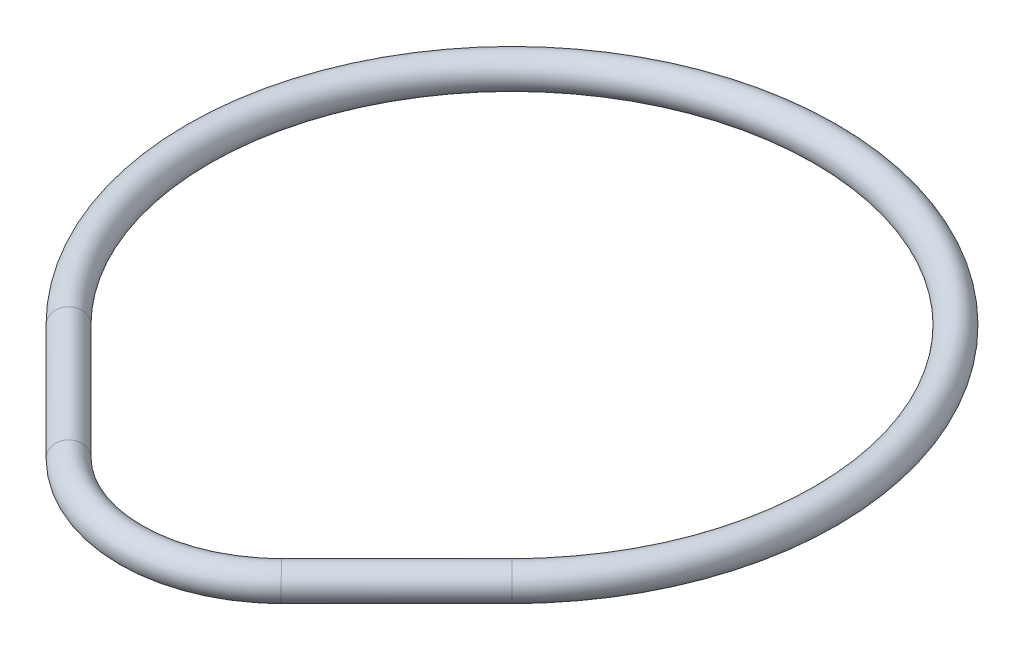
ISO-10303-21;
HEADER;
FILE_DESCRIPTION(('STEP AP214'),'2;1');
FILE_NAME('part.step','',(''),(''),'','','');
FILE_SCHEMA(('AUTOMOTIVE_DESIGN { 1 0 10303 214 1 1 1 1 }'));
ENDSEC;
DATA;
#1=APPLICATION_CONTEXT('core data for automotive mechanical design processes');
#2=APPLICATION_PROTOCOL_DEFINITION('international standard','automotive_design',2000,#1);
#3=PRODUCT_CONTEXT('',#1,'mechanical');
#4=PRODUCT('Part','Part','',(#3));
#5=PRODUCT_RELATED_PRODUCT_CATEGORY('part','',(#4));
#6=PRODUCT_DEFINITION_FORMATION('','',#4);
#7=PRODUCT_DEFINITION_CONTEXT('part definition',#1,'design');
#8=PRODUCT_DEFINITION('design','',#6,#7);
#9=PRODUCT_DEFINITION_SHAPE('','',#8);
#10=(LENGTH_UNIT() NAMED_UNIT(*) SI_UNIT(.MILLI.,.METRE.));
#11=(NAMED_UNIT(*) PLANE_ANGLE_UNIT() SI_UNIT($,.RADIAN.));
#12=(NAMED_UNIT(*) SI_UNIT($,.STERADIAN.) SOLID_ANGLE_UNIT());
#13=UNCERTAINTY_MEASURE_WITH_UNIT(LENGTH_MEASURE(1.E-05),#10,'distance_accuracy_value','');
#14=(GEOMETRIC_REPRESENTATION_CONTEXT(3) GLOBAL_UNCERTAINTY_ASSIGNED_CONTEXT((#13)) GLOBAL_UNIT_ASSIGNED_CONTEXT((#10,
#11,#12)) REPRESENTATION_CONTEXT('',''));
#15=CARTESIAN_POINT('',(0.,0.,0.));
#16=DIRECTION('',(0.,0.,1.));
#17=DIRECTION('',(1.,0.,0.));
#18=AXIS2_PLACEMENT_3D('',#15,#16,#17);
#19=CARTESIAN_POINT('',(-5.84601811404184E-13,6.66133814775094E-13,17.272));
#20=DIRECTION('',(0.,1.,0.));
#21=DIRECTION('',(0.,0.,1.));
#22=AXIS2_PLACEMENT_3D('',#19,#20,#21);
#23=TOROIDAL_SURFACE('',#22,11.2649,1.190625);
#24=CARTESIAN_POINT('',(7.96271324604783,0.,25.2402601470588));
#25=DIRECTION('',(0.707352941176472,0.,-0.706860535472871));
#26=DIRECTION('',(-0.706860535472871,0.,-0.707352941176472));
#27=AXIS2_PLACEMENT_3D('',#24,#25,#26);
#28=CIRCLE('',#27,1.190625);
#29=CARTESIAN_POINT('',(7.12110742100045,0.,24.3980680514706));
#30=VERTEX_POINT('',#29);
#31=EDGE_CURVE('E32',#30,#30,#28,.T.);
#32=ORIENTED_EDGE('',*,*,#31,.F.);
#33=EDGE_LOOP('',(#32));
#34=FACE_BOUND('',#33,.T.);
#35=CARTESIAN_POINT('',(-7.96271324604888,-1.39836830931388E-13,25.2402601470587));
#36=DIRECTION('',(0.70735294117647,0.,0.706860535472874));
#37=DIRECTION('',(0.706860535472874,0.,-0.70735294117647));
#38=AXIS2_PLACEMENT_3D('',#35,#36,#37);
#39=CIRCLE('',#38,1.190625);
#40=CARTESIAN_POINT('',(-7.12110742100149,-1.39836830931388E-13,24.3980680514705));
#41=VERTEX_POINT('',#40);
#42=EDGE_CURVE('E26',#41,#41,#39,.F.);
#43=ORIENTED_EDGE('',*,*,#42,.F.);
#44=EDGE_LOOP('',(#43));
#45=FACE_BOUND('',#44,.T.);
#46=ADVANCED_FACE('F14',(#34,#45),#23,.T.);
#47=CARTESIAN_POINT('',(7.96271324604783,0.,25.2402601470588));
#48=DIRECTION('',(0.707352941176472,0.,-0.706860535472871));
#49=DIRECTION('',(-0.706860535472871,0.,-0.707352941176472));
#50=AXIS2_PLACEMENT_3D('',#47,#48,#49);
#51=CYLINDRICAL_SURFACE('',#50,1.190625);
#52=CARTESIAN_POINT('',(16.5987111521344,0.,16.6102739705885));
#53=DIRECTION('',(-0.70735294117648,0.,0.706860535472863));
#54=DIRECTION('',(0.706860535472863,0.,0.70735294117648));
#55=AXIS2_PLACEMENT_3D('',#52,#53,#54);
#56=CIRCLE('',#55,1.190625);
#57=CARTESIAN_POINT('',(17.4403169771818,0.,17.4524660661767));
#58=VERTEX_POINT('',#57);
#59=EDGE_CURVE('E21',#58,#58,#56,.F.);
#60=ORIENTED_EDGE('',*,*,#59,.F.);
#61=EDGE_LOOP('',(#60));
#62=FACE_BOUND('',#61,.T.);
#63=ORIENTED_EDGE('',*,*,#31,.T.);
#64=EDGE_LOOP('',(#63));
#65=FACE_BOUND('',#64,.T.);
#66=ADVANCED_FACE('F36',(#62,#65),#51,.T.);
#67=CARTESIAN_POINT('',(-16.5987111521351,-1.38777878078145E-13,16.6102739705882));
#68=DIRECTION('',(0.70735294117647,0.,0.706860535472874));
#69=DIRECTION('',(0.706860535472874,0.,-0.70735294117647));
#70=AXIS2_PLACEMENT_3D('',#67,#68,#69);
#71=CYLINDRICAL_SURFACE('',#70,1.190625);
#72=ORIENTED_EDGE('',*,*,#42,.T.);
#73=EDGE_LOOP('',(#72));
#74=FACE_BOUND('',#73,.T.);
#75=CARTESIAN_POINT('',(-16.5987111521348,0.,16.610273970588));
#76=DIRECTION('',(-0.707352941176462,0.,-0.706860535472882));
#77=DIRECTION('',(-0.706860535472882,0.,0.707352941176462));
#78=AXIS2_PLACEMENT_3D('',#75,#76,#77);
#79=CIRCLE('',#78,1.190625);
#80=CARTESIAN_POINT('',(-17.4403169771822,0.,17.4524660661763));
#81=VERTEX_POINT('',#80);
#82=EDGE_CURVE('E10',#81,#81,#79,.T.);
#83=ORIENTED_EDGE('',*,*,#82,.F.);
#84=EDGE_LOOP('',(#83));
#85=FACE_BOUND('',#84,.T.);
#86=ADVANCED_FACE('F42',(#74,#85),#71,.T.);
#87=CARTESIAN_POINT('',(0.,0.,0.));
#88=DIRECTION('',(0.,-1.,0.));
#89=DIRECTION('',(0.,0.,-1.));
#90=AXIS2_PLACEMENT_3D('',#87,#88,#89);
#91=TOROIDAL_SURFACE('',#90,23.4823,1.190625);
#92=ORIENTED_EDGE('',*,*,#82,.T.);
#93=EDGE_LOOP('',(#92));
#94=FACE_BOUND('',#93,.T.);
#95=ORIENTED_EDGE('',*,*,#59,.T.);
#96=EDGE_LOOP('',(#95));
#97=FACE_BOUND('',#96,.T.);
#98=ADVANCED_FACE('F45',(#94,#97),#91,.T.);
#99=CLOSED_SHELL('',(#46,#66,#86,#98));
#100=MANIFOLD_SOLID_BREP('B1',#99);
#101=ADVANCED_BREP_SHAPE_REPRESENTATION('',(#18,#100),#14);
#102=SHAPE_DEFINITION_REPRESENTATION(#9,#101);
ENDSEC;
END-ISO-10303-21;
